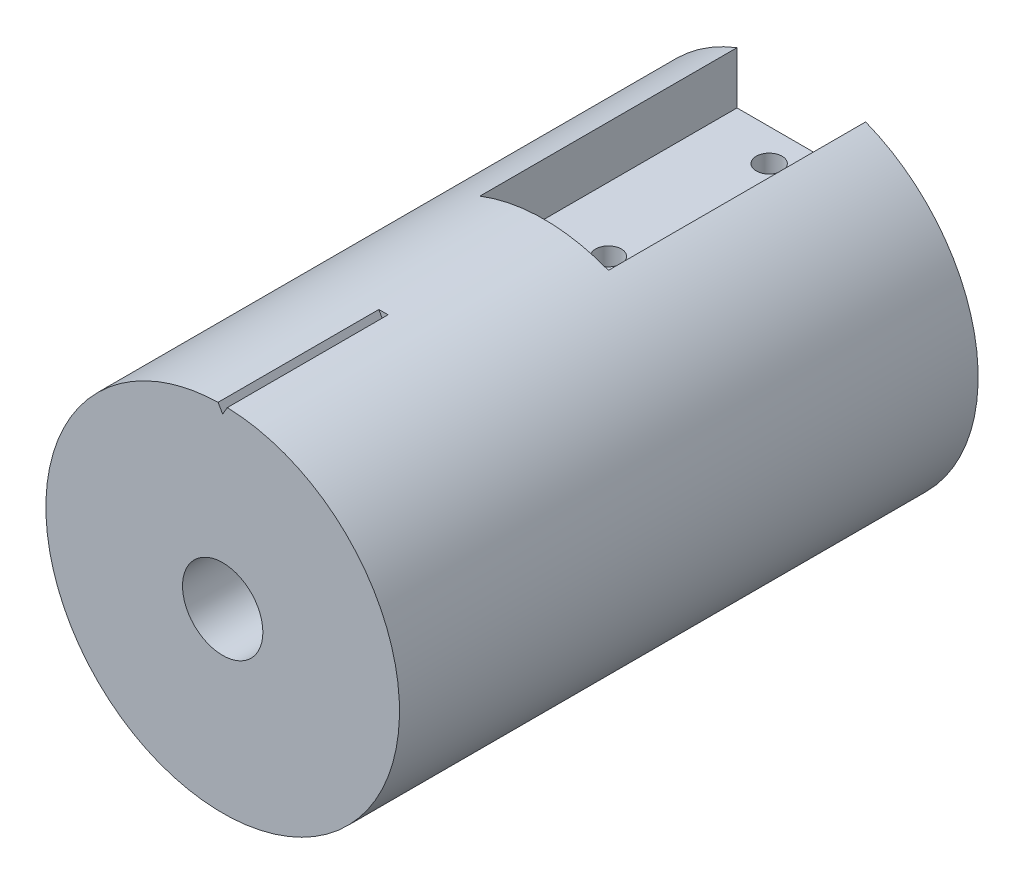
ISO-10303-21;
HEADER;
FILE_DESCRIPTION(('STEP AP214'),'2;1');
FILE_NAME('part.step','',(''),(''),'','','');
FILE_SCHEMA(('AUTOMOTIVE_DESIGN { 1 0 10303 214 1 1 1 1 }'));
ENDSEC;
DATA;
#1=APPLICATION_CONTEXT('core data for automotive mechanical design processes');
#2=APPLICATION_PROTOCOL_DEFINITION('international standard','automotive_design',2000,#1);
#3=PRODUCT_CONTEXT('',#1,'mechanical');
#4=PRODUCT('Part','Part','',(#3));
#5=PRODUCT_RELATED_PRODUCT_CATEGORY('part','',(#4));
#6=PRODUCT_DEFINITION_FORMATION('','',#4);
#7=PRODUCT_DEFINITION_CONTEXT('part definition',#1,'design');
#8=PRODUCT_DEFINITION('design','',#6,#7);
#9=PRODUCT_DEFINITION_SHAPE('','',#8);
#10=(LENGTH_UNIT() NAMED_UNIT(*) SI_UNIT(.MILLI.,.METRE.));
#11=(NAMED_UNIT(*) PLANE_ANGLE_UNIT() SI_UNIT($,.RADIAN.));
#12=(NAMED_UNIT(*) SI_UNIT($,.STERADIAN.) SOLID_ANGLE_UNIT());
#13=UNCERTAINTY_MEASURE_WITH_UNIT(LENGTH_MEASURE(1.E-05),#10,'distance_accuracy_value','');
#14=(GEOMETRIC_REPRESENTATION_CONTEXT(3) GLOBAL_UNCERTAINTY_ASSIGNED_CONTEXT((#13)) GLOBAL_UNIT_ASSIGNED_CONTEXT((#10,
#11,#12)) REPRESENTATION_CONTEXT('',''));
#15=CARTESIAN_POINT('',(0.,0.,0.));
#16=DIRECTION('',(0.,0.,1.));
#17=DIRECTION('',(1.,0.,0.));
#18=AXIS2_PLACEMENT_3D('',#15,#16,#17);
#19=CARTESIAN_POINT('',(0.,0.,36.));
#20=DIRECTION('',(0.,0.,-1.));
#21=DIRECTION('',(-1.,0.,0.));
#22=AXIS2_PLACEMENT_3D('',#19,#20,#21);
#23=CYLINDRICAL_SURFACE('',#22,11.);
#24=CARTESIAN_POINT('',(0.,-11.,12.8));
#25=CARTESIAN_POINT('',(0.0448727281654214,-10.9999996157806,12.7999980319196));
#26=CARTESIAN_POINT('',(0.089776479229688,-10.9997224911957,12.7962118792343));
#27=CARTESIAN_POINT('',(0.178342947858884,-10.9986436296314,12.7811631492176));
#28=CARTESIAN_POINT('',(0.222004178200268,-10.9978412894609,12.7698919753955));
#29=CARTESIAN_POINT('',(0.306789974159207,-10.9958027184029,12.7401996595551));
#30=CARTESIAN_POINT('',(0.347915908109583,-10.9945667240178,12.7217824142192));
#31=CARTESIAN_POINT('',(0.426482293110327,-10.991799674844,12.678327376434));
#32=CARTESIAN_POINT('',(0.463923560251857,-10.9902686856149,12.6532910545469));
#33=CARTESIAN_POINT('',(0.534142141994027,-10.9870802187786,12.5972547701837));
#34=CARTESIAN_POINT('',(0.566911186502641,-10.9854225246693,12.5662444559622));
#35=CARTESIAN_POINT('',(0.626784276546174,-10.9821693129453,12.4991621056395));
#36=CARTESIAN_POINT('',(0.653888079945355,-10.9805737979904,12.4630898532981));
#37=CARTESIAN_POINT('',(0.701688203177675,-10.9776231440671,12.3868589351331));
#38=CARTESIAN_POINT('',(0.722377430932676,-10.9762682718595,12.3466958110551));
#39=CARTESIAN_POINT('',(0.756715778859059,-10.9739545807479,12.2634543972951));
#40=CARTESIAN_POINT('',(0.770364996801715,-10.9729957563436,12.2203761481076));
#41=CARTESIAN_POINT('',(0.790212338581934,-10.9715844031589,12.1326088186454));
#42=CARTESIAN_POINT('',(0.796423714353373,-10.9711309740205,12.0879227498217));
#43=CARTESIAN_POINT('',(0.801259977101514,-10.9707788522827,11.9981401461355));
#44=CARTESIAN_POINT('',(0.799884975669985,-10.9708801515235,11.9530436173204));
#45=CARTESIAN_POINT('',(0.789598488945527,-10.971625227722,11.8638107497709));
#46=CARTESIAN_POINT('',(0.780701371388652,-10.9722679704785,11.8196727449305));
#47=CARTESIAN_POINT('',(0.755645511299682,-10.9740218813156,11.733518284642));
#48=CARTESIAN_POINT('',(0.739486712729898,-10.9751330530109,11.6915018455687));
#49=CARTESIAN_POINT('',(0.700349970272306,-10.9776998011552,11.610737215315));
#50=CARTESIAN_POINT('',(0.677365541296819,-10.979155704869,11.5719921774857));
#51=CARTESIAN_POINT('',(0.625234668367905,-10.9822475448232,11.498904656131));
#52=CARTESIAN_POINT('',(0.596088129832809,-10.9838834838268,11.464562240194));
#53=CARTESIAN_POINT('',(0.532379633176489,-10.9871556473116,11.4011712485563));
#54=CARTESIAN_POINT('',(0.497805246837798,-10.9887918636203,11.3721351614318));
#55=CARTESIAN_POINT('',(0.424265966697526,-10.9918765674835,11.3202774888399));
#56=CARTESIAN_POINT('',(0.385301070796094,-10.9933250549482,11.2974559063447));
#57=CARTESIAN_POINT('',(0.304079018586275,-10.9958712717048,11.2586759929037));
#58=CARTESIAN_POINT('',(0.261821618154452,-10.9969689749569,11.242718171446));
#59=CARTESIAN_POINT('',(0.175217627218325,-10.9986896125528,11.2181272885529));
#60=CARTESIAN_POINT('',(0.130871069748942,-10.9993125544012,11.2094941113372));
#61=CARTESIAN_POINT('',(0.0414559062542495,-11.0000125131052,11.1998131390133));
#62=CARTESIAN_POINT('',(-0.00361082183692782,-11.0000907720968,11.1987480848689));
#63=CARTESIAN_POINT('',(-0.0932822423618194,-10.9996958571894,11.2041884429702));
#64=CARTESIAN_POINT('',(-0.137886938062995,-10.9992226871928,11.2106938016415));
#65=CARTESIAN_POINT('',(-0.225319242113165,-10.9977789555405,11.2310760250806));
#66=CARTESIAN_POINT('',(-0.268148714672532,-10.996808930725,11.2449449342909));
#67=CARTESIAN_POINT('',(-0.350872435440195,-10.9944805452516,11.2796524712575));
#68=CARTESIAN_POINT('',(-0.390766648045124,-10.9931221798842,11.3004911835373));
#69=CARTESIAN_POINT('',(-0.466566211294776,-10.9901664817493,11.3485904714801));
#70=CARTESIAN_POINT('',(-0.502464257436571,-10.9885687235081,11.3758625317522));
#71=CARTESIAN_POINT('',(-0.569178849763543,-10.985315344906,11.436037703585));
#72=CARTESIAN_POINT('',(-0.599995328591249,-10.9836597237786,11.4689408897758));
#73=CARTESIAN_POINT('',(-0.655730821599607,-10.980473581394,11.539518973515));
#74=CARTESIAN_POINT('',(-0.680638608864045,-10.9789433018482,11.5772027493659));
#75=CARTESIAN_POINT('',(-0.723772801406305,-10.9761843131991,11.6562278860603));
#76=CARTESIAN_POINT('',(-0.741999259615166,-10.9749556017068,11.6975692179245));
#77=CARTESIAN_POINT('',(-0.771234113525473,-10.9729400777347,11.7826955029522));
#78=CARTESIAN_POINT('',(-0.782249487032952,-10.9721528381708,11.8264780492118));
#79=CARTESIAN_POINT('',(-0.796772242966234,-10.9711078671033,11.9152771518237));
#80=CARTESIAN_POINT('',(-0.800279731489333,-10.9708501281172,11.9602936907288));
#81=CARTESIAN_POINT('',(-0.799686047523857,-10.9708934103171,12.0501713318649));
#82=CARTESIAN_POINT('',(-0.79560251960164,-10.9711931357332,12.0950325523318));
#83=CARTESIAN_POINT('',(-0.779979398324271,-10.972314825,12.1834304073323));
#84=CARTESIAN_POINT('',(-0.768439792328293,-10.9731367897362,12.22696703962));
#85=CARTESIAN_POINT('',(-0.738236300996955,-10.9752100079133,12.3114817971331));
#86=CARTESIAN_POINT('',(-0.719572609532168,-10.9764612496721,12.3524599919469));
#87=CARTESIAN_POINT('',(-0.67565290131257,-10.9792520335999,12.4307039588885));
#88=CARTESIAN_POINT('',(-0.650397024551327,-10.9807915696463,12.4679698098295));
#89=CARTESIAN_POINT('',(-0.593943908900508,-10.9839896866129,12.5378212477164));
#90=CARTESIAN_POINT('',(-0.562733724427132,-10.9856485219193,12.5703963603524));
#91=CARTESIAN_POINT('',(-0.495279000727599,-10.9888960483844,12.6298573933936));
#92=CARTESIAN_POINT('',(-0.459033237966267,-10.9904847223714,12.6567419270944));
#93=CARTESIAN_POINT('',(-0.382482112089545,-10.9934151117332,12.704085733858));
#94=CARTESIAN_POINT('',(-0.34217067100793,-10.9947564486267,12.7245351930475));
#95=CARTESIAN_POINT('',(-0.258705189711756,-10.9970362981503,12.758349902911));
#96=CARTESIAN_POINT('',(-0.215554516531694,-10.9979752783448,12.7717233805982));
#97=CARTESIAN_POINT('',(-0.143453384677335,-10.999100826762,12.7875623652335));
#98=CARTESIAN_POINT('',(-0.114967953688137,-10.9994365016367,12.7922203710599));
#99=CARTESIAN_POINT('',(-0.057659285086938,-10.999886211494,12.7984398178029));
#100=CARTESIAN_POINT('',(-0.0288360481301953,-11.0000002469065,12.800001264725));
#101=CARTESIAN_POINT('',(0.,-11.,12.8));
#102=B_SPLINE_CURVE_WITH_KNOTS('',3,(#24,#25,#26,#27,#28,#29,#30,#31,#32,#33,#34,#35,#36,#37,
#38,#39,#40,#41,#42,#43,#44,#45,#46,#47,#48,#49,#50,#51,#52,#53,#54,#55,#56,#57,#58,#59,#60,#61,
#62,#63,#64,#65,#66,#67,#68,#69,#70,#71,#72,#73,#74,#75,#76,#77,#78,#79,#80,#81,#82,#83,#84,#85,
#86,#87,#88,#89,#90,#91,#92,#93,#94,#95,#96,#97,#98,#99,#100,#101),.UNSPECIFIED.,.T.,.F.,(4,2,2,
2,2,2,2,2,2,2,2,2,2,2,2,2,2,2,2,2,2,2,2,2,2,2,2,2,2,2,2,2,2,2,2,2,2,2,4),(0.,0.134512909336567,
0.269180573538326,0.403774907757515,0.538339364206943,0.673139126354718,0.80794464874609,
0.942898687558053,1.07785085208518,1.21256221413556,1.34727159465526,1.48172425119959,
1.61617794531985,1.75075979594949,1.88534371241392,2.02024040705173,2.15513716620688,
2.29004393684585,2.42494857497898,2.55954546528125,2.69414140307281,2.82859221884937,
2.96304466518435,3.09773897281381,3.23243506570723,3.36738507635801,3.50233401788037,
3.63715218227877,3.77196844148856,3.90647172541057,4.04097523736627,4.17547508928534,
4.30997208515874,4.44476490119248,4.57959052639466,4.71462078326661,4.84949369793984,
4.93593435820368,5.02237485082233),.UNSPECIFIED.);
#103=CARTESIAN_POINT('',(0.,-11.,12.8));
#104=VERTEX_POINT('',#103);
#105=EDGE_CURVE('E195',#104,#104,#102,.T.);
#106=ORIENTED_EDGE('',*,*,#105,.T.);
#107=EDGE_LOOP('',(#106));
#108=FACE_BOUND('',#107,.T.);
#109=CARTESIAN_POINT('',(0.,-11.,2.79999999999999));
#110=CARTESIAN_POINT('',(0.0448727281654214,-10.9999996157806,2.79999803191963));
#111=CARTESIAN_POINT('',(0.089776479229688,-10.9997224911957,2.79621187923428));
#112=CARTESIAN_POINT('',(0.178342947858884,-10.9986436296314,2.7811631492176));
#113=CARTESIAN_POINT('',(0.222004178200269,-10.9978412894609,2.76989197539547));
#114=CARTESIAN_POINT('',(0.306789974159207,-10.9958027184029,2.74019965955511));
#115=CARTESIAN_POINT('',(0.347915908109583,-10.9945667240178,2.72178241421917));
#116=CARTESIAN_POINT('',(0.426482293110327,-10.991799674844,2.67832737643397));
#117=CARTESIAN_POINT('',(0.463923560251857,-10.9902686856149,2.65329105454685));
#118=CARTESIAN_POINT('',(0.534142141994027,-10.9870802187786,2.59725477018372));
#119=CARTESIAN_POINT('',(0.566911186502641,-10.9854225246693,2.56624445596223));
#120=CARTESIAN_POINT('',(0.626784276546174,-10.9821693129453,2.49916210563951));
#121=CARTESIAN_POINT('',(0.653888079945355,-10.9805737979904,2.46308985329814));
#122=CARTESIAN_POINT('',(0.701688203177676,-10.9776231440671,2.38685893513305));
#123=CARTESIAN_POINT('',(0.722377430932677,-10.9762682718595,2.34669581105506));
#124=CARTESIAN_POINT('',(0.75671577885906,-10.9739545807479,2.26345439729507));
#125=CARTESIAN_POINT('',(0.770364996801715,-10.9729957563436,2.22037614810758));
#126=CARTESIAN_POINT('',(0.790212338581934,-10.9715844031589,2.13260881864536));
#127=CARTESIAN_POINT('',(0.796423714353373,-10.9711309740205,2.08792274982173));
#128=CARTESIAN_POINT('',(0.801259977101514,-10.9707788522827,1.99814014613554));
#129=CARTESIAN_POINT('',(0.799884975669985,-10.9708801515235,1.95304361732038));
#130=CARTESIAN_POINT('',(0.789598488945527,-10.971625227722,1.86381074977091));
#131=CARTESIAN_POINT('',(0.780701371388652,-10.9722679704785,1.81967274493047));
#132=CARTESIAN_POINT('',(0.755645511299682,-10.9740218813156,1.73351828464204));
#133=CARTESIAN_POINT('',(0.739486712729899,-10.9751330530109,1.69150184556875));
#134=CARTESIAN_POINT('',(0.700349970272307,-10.9776998011552,1.61073721531496));
#135=CARTESIAN_POINT('',(0.67736554129682,-10.979155704869,1.57199217748573));
#136=CARTESIAN_POINT('',(0.625234668367906,-10.9822475448232,1.49890465613101));
#137=CARTESIAN_POINT('',(0.59608812983281,-10.9838834838268,1.46456224019395));
#138=CARTESIAN_POINT('',(0.532379633176489,-10.9871556473116,1.40117124855635));
#139=CARTESIAN_POINT('',(0.497805246837798,-10.9887918636203,1.37213516143181));
#140=CARTESIAN_POINT('',(0.424265966697525,-10.9918765674835,1.32027748883989));
#141=CARTESIAN_POINT('',(0.385301070796093,-10.9933250549482,1.29745590634473));
#142=CARTESIAN_POINT('',(0.304079018586274,-10.9958712717048,1.25867599290373));
#143=CARTESIAN_POINT('',(0.261821618154452,-10.9969689749569,1.24271817144595));
#144=CARTESIAN_POINT('',(0.175217627218325,-10.9986896125528,1.21812728855286));
#145=CARTESIAN_POINT('',(0.130871069748941,-10.9993125544012,1.20949411133717));
#146=CARTESIAN_POINT('',(0.0414559062542487,-11.0000125131052,1.19981313901332));
#147=CARTESIAN_POINT('',(-0.00361082183692843,-11.0000907720968,1.19874808486893));
#148=CARTESIAN_POINT('',(-0.0932822423618197,-10.9996958571894,1.20418844297023));
#149=CARTESIAN_POINT('',(-0.137886938062995,-10.9992226871928,1.21069380164154));
#150=CARTESIAN_POINT('',(-0.225319242113165,-10.9977789555405,1.23107602508063));
#151=CARTESIAN_POINT('',(-0.268148714672532,-10.996808930725,1.24494493429091));
#152=CARTESIAN_POINT('',(-0.350872435440195,-10.9944805452516,1.27965247125746));
#153=CARTESIAN_POINT('',(-0.390766648045124,-10.9931221798842,1.30049118353726));
#154=CARTESIAN_POINT('',(-0.466566211294776,-10.9901664817493,1.34859047148009));
#155=CARTESIAN_POINT('',(-0.502464257436571,-10.9885687235081,1.37586253175223));
#156=CARTESIAN_POINT('',(-0.569178849763544,-10.985315344906,1.43603770358499));
#157=CARTESIAN_POINT('',(-0.59999532859125,-10.9836597237786,1.46894088977585));
#158=CARTESIAN_POINT('',(-0.655730821599607,-10.980473581394,1.53951897351504));
#159=CARTESIAN_POINT('',(-0.680638608864044,-10.9789433018482,1.57720274936591));
#160=CARTESIAN_POINT('',(-0.723772801406304,-10.9761843131991,1.65622788606026));
#161=CARTESIAN_POINT('',(-0.741999259615166,-10.9749556017068,1.69756921792452));
#162=CARTESIAN_POINT('',(-0.771234113525473,-10.9729400777347,1.78269550295222));
#163=CARTESIAN_POINT('',(-0.782249487032952,-10.9721528381708,1.8264780492118));
#164=CARTESIAN_POINT('',(-0.796772242966234,-10.9711078671033,1.91527715182371));
#165=CARTESIAN_POINT('',(-0.800279731489333,-10.9708501281172,1.96029369072884));
#166=CARTESIAN_POINT('',(-0.799686047523857,-10.9708934103171,2.05017133186488));
#167=CARTESIAN_POINT('',(-0.79560251960164,-10.9711931357332,2.09503255233185));
#168=CARTESIAN_POINT('',(-0.779979398324271,-10.972314825,2.18343040733232));
#169=CARTESIAN_POINT('',(-0.768439792328293,-10.9731367897362,2.22696703962003));
#170=CARTESIAN_POINT('',(-0.738236300996955,-10.9752100079133,2.31148179713308));
#171=CARTESIAN_POINT('',(-0.719572609532167,-10.9764612496721,2.35245999194688));
#172=CARTESIAN_POINT('',(-0.67565290131257,-10.9792520335999,2.43070395888849));
#173=CARTESIAN_POINT('',(-0.650397024551326,-10.9807915696463,2.46796980982949));
#174=CARTESIAN_POINT('',(-0.593943908900507,-10.9839896866129,2.53782124771642));
#175=CARTESIAN_POINT('',(-0.562733724427132,-10.9856485219193,2.57039636035239));
#176=CARTESIAN_POINT('',(-0.495279000727599,-10.9888960483844,2.62985739339363));
#177=CARTESIAN_POINT('',(-0.459033237966267,-10.9904847223714,2.65674192709437));
#178=CARTESIAN_POINT('',(-0.382482112089544,-10.9934151117332,2.70408573385799));
#179=CARTESIAN_POINT('',(-0.34217067100793,-10.9947564486267,2.72453519304755));
#180=CARTESIAN_POINT('',(-0.258705189711756,-10.9970362981503,2.75834990291102));
#181=CARTESIAN_POINT('',(-0.215554516531694,-10.9979752783448,2.77172338059825));
#182=CARTESIAN_POINT('',(-0.143453384677334,-10.999100826762,2.78756236523349));
#183=CARTESIAN_POINT('',(-0.114967953688136,-10.9994365016367,2.79222037105989));
#184=CARTESIAN_POINT('',(-0.0576592850869375,-10.999886211494,2.79843981780286));
#185=CARTESIAN_POINT('',(-0.0288360481301951,-11.0000002469065,2.80000126472496));
#186=CARTESIAN_POINT('',(0.,-11.,2.79999999999999));
#187=B_SPLINE_CURVE_WITH_KNOTS('',3,(#109,#110,#111,#112,#113,#114,#115,#116,#117,#118,#119,
#120,#121,#122,#123,#124,#125,#126,#127,#128,#129,#130,#131,#132,#133,#134,#135,#136,#137,#138,
#139,#140,#141,#142,#143,#144,#145,#146,#147,#148,#149,#150,#151,#152,#153,#154,#155,#156,#157,
#158,#159,#160,#161,#162,#163,#164,#165,#166,#167,#168,#169,#170,#171,#172,#173,#174,#175,#176,
#177,#178,#179,#180,#181,#182,#183,#184,#185,#186),.UNSPECIFIED.,.T.,.F.,(4,2,2,2,2,2,2,2,2,2,2,
2,2,2,2,2,2,2,2,2,2,2,2,2,2,2,2,2,2,2,2,2,2,2,2,2,2,2,4),(0.,0.134512909336567,
0.269180573538326,0.403774907757516,0.538339364206944,0.673139126354718,0.80794464874609,
0.942898687558054,1.07785085208518,1.21256221413556,1.34727159465526,1.48172425119959,
1.61617794531985,1.75075979594949,1.88534371241391,2.02024040705173,2.15513716620688,
2.29004393684585,2.42494857497898,2.55954546528125,2.69414140307281,2.82859221884937,
2.96304466518435,3.09773897281381,3.23243506570723,3.36738507635801,3.50233401788037,
3.63715218227877,3.77196844148856,3.90647172541057,4.04097523736628,4.17547508928534,
4.30997208515874,4.44476490119249,4.57959052639466,4.71462078326662,4.84949369793985,
4.93593435820368,5.02237485082233),.UNSPECIFIED.);
#188=CARTESIAN_POINT('',(0.,-11.,2.79999999999999));
#189=VERTEX_POINT('',#188);
#190=EDGE_CURVE('E198',#189,#189,#187,.T.);
#191=ORIENTED_EDGE('',*,*,#190,.T.);
#192=EDGE_LOOP('',(#191));
#193=FACE_BOUND('',#192,.T.);
#194=CARTESIAN_POINT('',(0.,0.,26.));
#195=DIRECTION('',(0.,0.,1.));
#196=DIRECTION('',(1.,0.,0.));
#197=AXIS2_PLACEMENT_3D('',#194,#195,#196);
#198=CIRCLE('',#197,11.);
#199=CARTESIAN_POINT('',(0.286520362426996,10.9962678251266,26.));
#200=VERTEX_POINT('',#199);
#201=CARTESIAN_POINT('',(-0.286520362426997,10.9962678251266,26.));
#202=VERTEX_POINT('',#201);
#203=EDGE_CURVE('E116',#200,#202,#198,.T.);
#204=ORIENTED_EDGE('',*,*,#203,.F.);
#205=DIRECTION('',(0.,0.,1.));
#206=VECTOR('',#205,1.);
#207=CARTESIAN_POINT('',(0.286520362426996,10.9962678251266,26.));
#208=LINE('',#207,#206);
#209=CARTESIAN_POINT('',(0.286520362426996,10.9962678251266,36.));
#210=VERTEX_POINT('',#209);
#211=EDGE_CURVE('E129',#200,#210,#208,.T.);
#212=ORIENTED_EDGE('',*,*,#211,.T.);
#213=CARTESIAN_POINT('',(0.,0.,36.));
#214=DIRECTION('',(0.,0.,1.));
#215=DIRECTION('',(1.,0.,0.));
#216=AXIS2_PLACEMENT_3D('',#213,#214,#215);
#217=CIRCLE('',#216,11.);
#218=CARTESIAN_POINT('',(-0.286520362426997,10.9962678251266,36.));
#219=VERTEX_POINT('',#218);
#220=EDGE_CURVE('E127',#219,#210,#217,.T.);
#221=ORIENTED_EDGE('',*,*,#220,.F.);
#222=DIRECTION('',(0.,0.,1.));
#223=VECTOR('',#222,1.);
#224=CARTESIAN_POINT('',(-0.286520362426997,10.9962678251266,26.));
#225=LINE('',#224,#223);
#226=EDGE_CURVE('E64',#202,#219,#225,.T.);
#227=ORIENTED_EDGE('',*,*,#226,.F.);
#228=EDGE_LOOP('',(#204,#212,#221,#227));
#229=FACE_BOUND('',#228,.T.);
#230=CARTESIAN_POINT('',(0.,0.,16.));
#231=DIRECTION('',(0.,0.,1.));
#232=DIRECTION('',(1.,0.,0.));
#233=AXIS2_PLACEMENT_3D('',#230,#231,#232);
#234=CIRCLE('',#233,11.);
#235=CARTESIAN_POINT('',(4.,10.2469507659596,16.));
#236=VERTEX_POINT('',#235);
#237=CARTESIAN_POINT('',(-4.,10.2469507659596,16.));
#238=VERTEX_POINT('',#237);
#239=EDGE_CURVE('E13',#236,#238,#234,.T.);
#240=ORIENTED_EDGE('',*,*,#239,.T.);
#241=DIRECTION('',(0.,0.,-1.));
#242=VECTOR('',#241,1.);
#243=CARTESIAN_POINT('',(-4.,10.2469507659596,36.));
#244=LINE('',#243,#242);
#245=CARTESIAN_POINT('',(-4.,10.2469507659596,0.));
#246=VERTEX_POINT('',#245);
#247=EDGE_CURVE('E153',#238,#246,#244,.T.);
#248=ORIENTED_EDGE('',*,*,#247,.T.);
#249=CARTESIAN_POINT('',(0.,0.,0.));
#250=DIRECTION('',(0.,0.,1.));
#251=DIRECTION('',(1.,0.,0.));
#252=AXIS2_PLACEMENT_3D('',#249,#250,#251);
#253=CIRCLE('',#252,11.);
#254=CARTESIAN_POINT('',(4.,10.2469507659596,0.));
#255=VERTEX_POINT('',#254);
#256=EDGE_CURVE('E156',#246,#255,#253,.T.);
#257=ORIENTED_EDGE('',*,*,#256,.T.);
#258=DIRECTION('',(0.,0.,-1.));
#259=VECTOR('',#258,1.);
#260=CARTESIAN_POINT('',(4.,10.2469507659596,36.));
#261=LINE('',#260,#259);
#262=EDGE_CURVE('E72',#255,#236,#261,.F.);
#263=ORIENTED_EDGE('',*,*,#262,.T.);
#264=EDGE_LOOP('',(#240,#248,#257,#263));
#265=FACE_BOUND('',#264,.T.);
#266=ADVANCED_FACE('F50',(#108,#193,#229,#265),#23,.T.);
#267=CARTESIAN_POINT('',(0.,0.,36.));
#268=DIRECTION('',(0.,0.,1.));
#269=DIRECTION('',(1.,0.,0.));
#270=AXIS2_PLACEMENT_3D('',#267,#268,#269);
#271=PLANE('',#270);
#272=CARTESIAN_POINT('',(0.,0.,36.));
#273=DIRECTION('',(0.,0.,1.));
#274=DIRECTION('',(1.,0.,0.));
#275=AXIS2_PLACEMENT_3D('',#272,#273,#274);
#276=CIRCLE('',#275,2.5);
#277=CARTESIAN_POINT('',(2.5,0.,36.));
#278=VERTEX_POINT('',#277);
#279=EDGE_CURVE('E231',#278,#278,#276,.T.);
#280=ORIENTED_EDGE('',*,*,#279,.F.);
#281=EDGE_LOOP('',(#280));
#282=FACE_BOUND('',#281,.T.);
#283=DIRECTION('',(0.499999999999998,0.86602540378444,0.));
#284=VECTOR('',#283,1.);
#285=CARTESIAN_POINT('',(0.,10.5,36.));
#286=LINE('',#285,#284);
#287=CARTESIAN_POINT('',(0.,10.5,36.));
#288=VERTEX_POINT('',#287);
#289=EDGE_CURVE('E122',#288,#210,#286,.T.);
#290=ORIENTED_EDGE('',*,*,#289,.F.);
#291=DIRECTION('',(0.499999999999998,-0.86602540378444,0.));
#292=VECTOR('',#291,1.);
#293=CARTESIAN_POINT('',(-0.286520362426997,10.9962678251266,36.));
#294=LINE('',#293,#292);
#295=EDGE_CURVE('E200',#219,#288,#294,.T.);
#296=ORIENTED_EDGE('',*,*,#295,.F.);
#297=ORIENTED_EDGE('',*,*,#220,.T.);
#298=EDGE_LOOP('',(#290,#296,#297));
#299=FACE_BOUND('',#298,.T.);
#300=ADVANCED_FACE('F185',(#282,#299),#271,.T.);
#301=CARTESIAN_POINT('',(0.,0.,0.));
#302=DIRECTION('',(0.,0.,1.));
#303=DIRECTION('',(1.,0.,0.));
#304=AXIS2_PLACEMENT_3D('',#301,#302,#303);
#305=PLANE('',#304);
#306=ORIENTED_EDGE('',*,*,#256,.F.);
#307=DIRECTION('',(0.,1.,0.));
#308=VECTOR('',#307,1.);
#309=CARTESIAN_POINT('',(-4.,7.,0.));
#310=LINE('',#309,#308);
#311=CARTESIAN_POINT('',(-4.,7.,0.));
#312=VERTEX_POINT('',#311);
#313=EDGE_CURVE('E144',#312,#246,#310,.T.);
#314=ORIENTED_EDGE('',*,*,#313,.F.);
#315=DIRECTION('',(-1.,0.,0.));
#316=VECTOR('',#315,1.);
#317=CARTESIAN_POINT('',(4.,7.,0.));
#318=LINE('',#317,#316);
#319=CARTESIAN_POINT('',(4.,7.,0.));
#320=VERTEX_POINT('',#319);
#321=EDGE_CURVE('E138',#320,#312,#318,.T.);
#322=ORIENTED_EDGE('',*,*,#321,.F.);
#323=DIRECTION('',(0.,1.,0.));
#324=VECTOR('',#323,1.);
#325=CARTESIAN_POINT('',(4.,0.,0.));
#326=LINE('',#325,#324);
#327=EDGE_CURVE('E57',#320,#255,#326,.T.);
#328=ORIENTED_EDGE('',*,*,#327,.T.);
#329=EDGE_LOOP('',(#306,#314,#322,#328));
#330=FACE_BOUND('',#329,.T.);
#331=ADVANCED_FACE('F162',(#330),#305,.F.);
#332=CARTESIAN_POINT('',(0.,0.,16.));
#333=DIRECTION('',(0.,0.,1.));
#334=DIRECTION('',(1.,0.,0.));
#335=AXIS2_PLACEMENT_3D('',#332,#333,#334);
#336=PLANE('',#335);
#337=DIRECTION('',(0.,-1.,0.));
#338=VECTOR('',#337,1.);
#339=CARTESIAN_POINT('',(4.,7.,16.));
#340=LINE('',#339,#338);
#341=CARTESIAN_POINT('',(4.,7.,16.));
#342=VERTEX_POINT('',#341);
#343=EDGE_CURVE('E137',#236,#342,#340,.T.);
#344=ORIENTED_EDGE('',*,*,#343,.T.);
#345=DIRECTION('',(-1.,0.,0.));
#346=VECTOR('',#345,1.);
#347=CARTESIAN_POINT('',(4.,7.,16.));
#348=LINE('',#347,#346);
#349=CARTESIAN_POINT('',(-4.,7.,16.));
#350=VERTEX_POINT('',#349);
#351=EDGE_CURVE('E140',#342,#350,#348,.T.);
#352=ORIENTED_EDGE('',*,*,#351,.T.);
#353=DIRECTION('',(0.,1.,0.));
#354=VECTOR('',#353,1.);
#355=CARTESIAN_POINT('',(-4.,7.,16.));
#356=LINE('',#355,#354);
#357=EDGE_CURVE('E134',#350,#238,#356,.T.);
#358=ORIENTED_EDGE('',*,*,#357,.T.);
#359=ORIENTED_EDGE('',*,*,#239,.F.);
#360=EDGE_LOOP('',(#344,#352,#358,#359));
#361=FACE_BOUND('',#360,.T.);
#362=ADVANCED_FACE('F169',(#361),#336,.F.);
#363=CARTESIAN_POINT('',(-4.,7.,16.));
#364=DIRECTION('',(-1.,0.,0.));
#365=DIRECTION('',(0.,0.,1.));
#366=AXIS2_PLACEMENT_3D('',#363,#364,#365);
#367=PLANE('',#366);
#368=ORIENTED_EDGE('',*,*,#357,.F.);
#369=DIRECTION('',(0.,0.,-1.));
#370=VECTOR('',#369,1.);
#371=CARTESIAN_POINT('',(-4.,7.,16.));
#372=LINE('',#371,#370);
#373=EDGE_CURVE('E148',#350,#312,#372,.T.);
#374=ORIENTED_EDGE('',*,*,#373,.T.);
#375=ORIENTED_EDGE('',*,*,#313,.T.);
#376=ORIENTED_EDGE('',*,*,#247,.F.);
#377=EDGE_LOOP('',(#368,#374,#375,#376));
#378=FACE_BOUND('',#377,.T.);
#379=ADVANCED_FACE('F167',(#378),#367,.F.);
#380=CARTESIAN_POINT('',(4.,7.,16.));
#381=DIRECTION('',(1.,0.,0.));
#382=DIRECTION('',(0.,0.,-1.));
#383=AXIS2_PLACEMENT_3D('',#380,#381,#382);
#384=PLANE('',#383);
#385=ORIENTED_EDGE('',*,*,#327,.F.);
#386=DIRECTION('',(0.,0.,-1.));
#387=VECTOR('',#386,1.);
#388=CARTESIAN_POINT('',(4.,7.,16.));
#389=LINE('',#388,#387);
#390=EDGE_CURVE('E143',#342,#320,#389,.T.);
#391=ORIENTED_EDGE('',*,*,#390,.F.);
#392=ORIENTED_EDGE('',*,*,#343,.F.);
#393=ORIENTED_EDGE('',*,*,#262,.F.);
#394=EDGE_LOOP('',(#385,#391,#392,#393));
#395=FACE_BOUND('',#394,.T.);
#396=ADVANCED_FACE('F173',(#395),#384,.F.);
#397=CARTESIAN_POINT('',(4.,7.,16.));
#398=DIRECTION('',(0.,-1.,0.));
#399=DIRECTION('',(0.,0.,-1.));
#400=AXIS2_PLACEMENT_3D('',#397,#398,#399);
#401=PLANE('',#400);
#402=CARTESIAN_POINT('',(0.,7.,12.));
#403=DIRECTION('',(0.,1.,0.));
#404=DIRECTION('',(0.,0.,1.));
#405=AXIS2_PLACEMENT_3D('',#402,#403,#404);
#406=CIRCLE('',#405,0.799999999999988);
#407=CARTESIAN_POINT('',(0.,7.,12.8));
#408=VERTEX_POINT('',#407);
#409=EDGE_CURVE('E227',#408,#408,#406,.T.);
#410=ORIENTED_EDGE('',*,*,#409,.F.);
#411=EDGE_LOOP('',(#410));
#412=FACE_BOUND('',#411,.T.);
#413=CARTESIAN_POINT('',(0.,7.,2.));
#414=DIRECTION('',(0.,1.,0.));
#415=DIRECTION('',(0.,0.,1.));
#416=AXIS2_PLACEMENT_3D('',#413,#414,#415);
#417=CIRCLE('',#416,0.799999999999988);
#418=CARTESIAN_POINT('',(0.,7.,2.79999999999999));
#419=VERTEX_POINT('',#418);
#420=EDGE_CURVE('E201',#419,#419,#417,.T.);
#421=ORIENTED_EDGE('',*,*,#420,.F.);
#422=EDGE_LOOP('',(#421));
#423=FACE_BOUND('',#422,.T.);
#424=ORIENTED_EDGE('',*,*,#321,.T.);
#425=ORIENTED_EDGE('',*,*,#373,.F.);
#426=ORIENTED_EDGE('',*,*,#351,.F.);
#427=ORIENTED_EDGE('',*,*,#390,.T.);
#428=EDGE_LOOP('',(#424,#425,#426,#427));
#429=FACE_BOUND('',#428,.T.);
#430=ADVANCED_FACE('F172',(#412,#423,#429),#401,.F.);
#431=CARTESIAN_POINT('',(0.,10.5,26.));
#432=DIRECTION('',(0.86602540378444,-0.499999999999998,0.));
#433=DIRECTION('',(0.499999999999998,0.86602540378444,0.));
#434=AXIS2_PLACEMENT_3D('',#431,#432,#433);
#435=PLANE('',#434);
#436=ORIENTED_EDGE('',*,*,#289,.T.);
#437=ORIENTED_EDGE('',*,*,#211,.F.);
#438=DIRECTION('',(0.499999999999998,0.86602540378444,0.));
#439=VECTOR('',#438,1.);
#440=CARTESIAN_POINT('',(0.,10.5,26.));
#441=LINE('',#440,#439);
#442=CARTESIAN_POINT('',(0.,10.5,26.));
#443=VERTEX_POINT('',#442);
#444=EDGE_CURVE('E115',#443,#200,#441,.T.);
#445=ORIENTED_EDGE('',*,*,#444,.F.);
#446=DIRECTION('',(0.,0.,1.));
#447=VECTOR('',#446,1.);
#448=CARTESIAN_POINT('',(0.,10.5,26.));
#449=LINE('',#448,#447);
#450=EDGE_CURVE('E111',#443,#288,#449,.T.);
#451=ORIENTED_EDGE('',*,*,#450,.T.);
#452=EDGE_LOOP('',(#436,#437,#445,#451));
#453=FACE_BOUND('',#452,.T.);
#454=ADVANCED_FACE('F180',(#453),#435,.F.);
#455=CARTESIAN_POINT('',(-0.286520362426997,10.9962678251266,26.));
#456=DIRECTION('',(-0.86602540378444,-0.499999999999998,0.));
#457=DIRECTION('',(0.499999999999998,-0.86602540378444,0.));
#458=AXIS2_PLACEMENT_3D('',#455,#456,#457);
#459=PLANE('',#458);
#460=ORIENTED_EDGE('',*,*,#295,.T.);
#461=ORIENTED_EDGE('',*,*,#450,.F.);
#462=DIRECTION('',(0.499999999999998,-0.86602540378444,0.));
#463=VECTOR('',#462,1.);
#464=CARTESIAN_POINT('',(-0.286520362426997,10.9962678251266,26.));
#465=LINE('',#464,#463);
#466=EDGE_CURVE('E108',#202,#443,#465,.T.);
#467=ORIENTED_EDGE('',*,*,#466,.F.);
#468=ORIENTED_EDGE('',*,*,#226,.T.);
#469=EDGE_LOOP('',(#460,#461,#467,#468));
#470=FACE_BOUND('',#469,.T.);
#471=ADVANCED_FACE('F110',(#470),#459,.F.);
#472=CARTESIAN_POINT('',(0.,0.,26.));
#473=DIRECTION('',(0.,0.,1.));
#474=DIRECTION('',(1.,0.,0.));
#475=AXIS2_PLACEMENT_3D('',#472,#473,#474);
#476=PLANE('',#475);
#477=ORIENTED_EDGE('',*,*,#203,.T.);
#478=ORIENTED_EDGE('',*,*,#466,.T.);
#479=ORIENTED_EDGE('',*,*,#444,.T.);
#480=EDGE_LOOP('',(#477,#478,#479));
#481=FACE_BOUND('',#480,.T.);
#482=ADVANCED_FACE('F119',(#481),#476,.T.);
#483=CARTESIAN_POINT('',(0.,7.,2.));
#484=DIRECTION('',(0.,1.,0.));
#485=DIRECTION('',(0.,0.,1.));
#486=AXIS2_PLACEMENT_3D('',#483,#484,#485);
#487=CYLINDRICAL_SURFACE('',#486,0.799999999999992);
#488=ORIENTED_EDGE('',*,*,#190,.F.);
#489=EDGE_LOOP('',(#488));
#490=FACE_BOUND('',#489,.T.);
#491=ORIENTED_EDGE('',*,*,#420,.T.);
#492=EDGE_LOOP('',(#491));
#493=FACE_BOUND('',#492,.T.);
#494=ADVANCED_FACE('F214',(#490,#493),#487,.F.);
#495=CARTESIAN_POINT('',(0.,7.,12.));
#496=DIRECTION('',(0.,1.,0.));
#497=DIRECTION('',(0.,0.,1.));
#498=AXIS2_PLACEMENT_3D('',#495,#496,#497);
#499=CYLINDRICAL_SURFACE('',#498,0.799999999999992);
#500=ORIENTED_EDGE('',*,*,#105,.F.);
#501=EDGE_LOOP('',(#500));
#502=FACE_BOUND('',#501,.T.);
#503=ORIENTED_EDGE('',*,*,#409,.T.);
#504=EDGE_LOOP('',(#503));
#505=FACE_BOUND('',#504,.T.);
#506=ADVANCED_FACE('F218',(#502,#505),#499,.F.);
#507=CARTESIAN_POINT('',(0.,0.,28.));
#508=DIRECTION('',(0.,0.,1.));
#509=DIRECTION('',(1.,0.,0.));
#510=AXIS2_PLACEMENT_3D('',#507,#508,#509);
#511=CYLINDRICAL_SURFACE('',#510,2.5);
#512=CARTESIAN_POINT('',(0.,0.,28.));
#513=DIRECTION('',(0.,0.,1.));
#514=DIRECTION('',(1.,0.,0.));
#515=AXIS2_PLACEMENT_3D('',#512,#513,#514);
#516=CIRCLE('',#515,2.5);
#517=CARTESIAN_POINT('',(2.5,0.,28.));
#518=VERTEX_POINT('',#517);
#519=EDGE_CURVE('E230',#518,#518,#516,.T.);
#520=ORIENTED_EDGE('',*,*,#519,.F.);
#521=EDGE_LOOP('',(#520));
#522=FACE_BOUND('',#521,.T.);
#523=ORIENTED_EDGE('',*,*,#279,.T.);
#524=EDGE_LOOP('',(#523));
#525=FACE_BOUND('',#524,.T.);
#526=ADVANCED_FACE('F239',(#522,#525),#511,.F.);
#527=CARTESIAN_POINT('',(0.,0.,28.));
#528=DIRECTION('',(0.,0.,1.));
#529=DIRECTION('',(1.,0.,0.));
#530=AXIS2_PLACEMENT_3D('',#527,#528,#529);
#531=PLANE('',#530);
#532=ORIENTED_EDGE('',*,*,#519,.T.);
#533=EDGE_LOOP('',(#532));
#534=FACE_BOUND('',#533,.T.);
#535=ADVANCED_FACE('F237',(#534),#531,.T.);
#536=CLOSED_SHELL('',(#266,#300,#331,#362,#379,#396,#430,#454,#471,#482,#494,#506,#526,#535));
#537=MANIFOLD_SOLID_BREP('B2',#536);
#538=ADVANCED_BREP_SHAPE_REPRESENTATION('',(#18,#537),#14);
#539=SHAPE_DEFINITION_REPRESENTATION(#9,#538);
ENDSEC;
END-ISO-10303-21;
